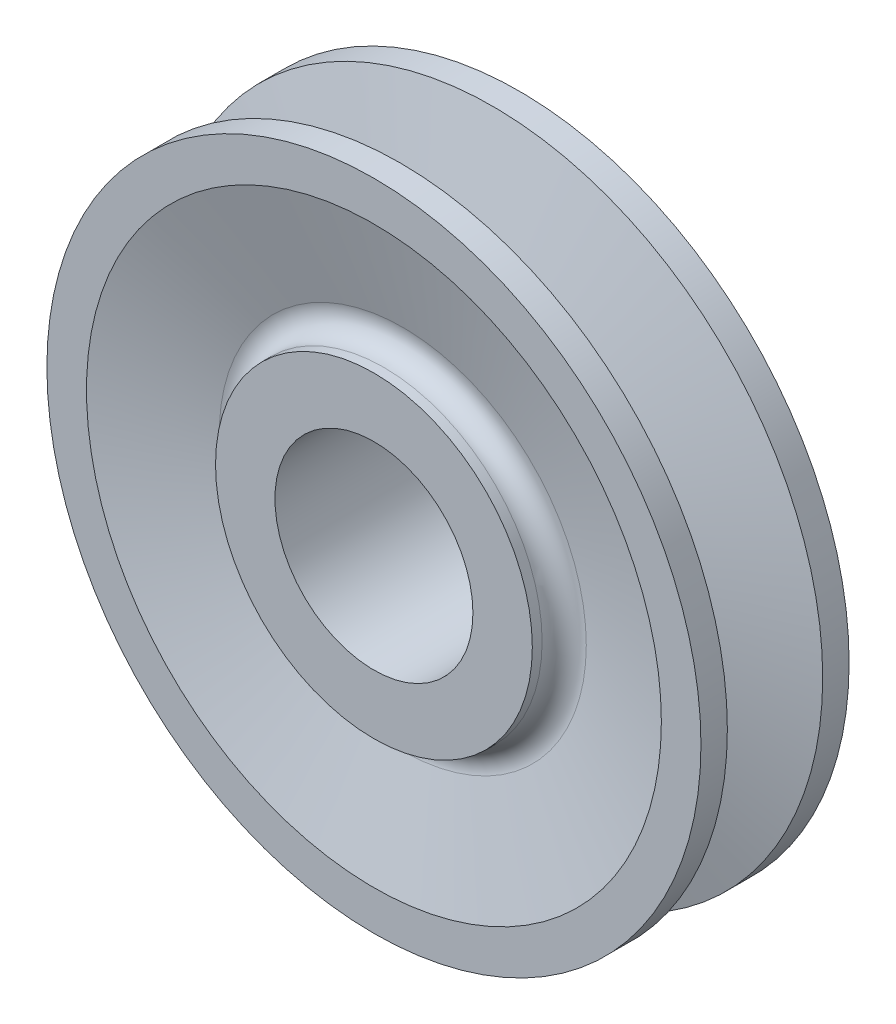
ISO-10303-21;
HEADER;
FILE_DESCRIPTION(('STEP AP214'),'2;1');
FILE_NAME('part.step','',(''),(''),'','','');
FILE_SCHEMA(('AUTOMOTIVE_DESIGN { 1 0 10303 214 1 1 1 1 }'));
ENDSEC;
DATA;
#1=APPLICATION_CONTEXT('core data for automotive mechanical design processes');
#2=APPLICATION_PROTOCOL_DEFINITION('international standard','automotive_design',2000,#1);
#3=PRODUCT_CONTEXT('',#1,'mechanical');
#4=PRODUCT('Part','Part','',(#3));
#5=PRODUCT_RELATED_PRODUCT_CATEGORY('part','',(#4));
#6=PRODUCT_DEFINITION_FORMATION('','',#4);
#7=PRODUCT_DEFINITION_CONTEXT('part definition',#1,'design');
#8=PRODUCT_DEFINITION('design','',#6,#7);
#9=PRODUCT_DEFINITION_SHAPE('','',#8);
#10=(LENGTH_UNIT() NAMED_UNIT(*) SI_UNIT(.MILLI.,.METRE.));
#11=(NAMED_UNIT(*) PLANE_ANGLE_UNIT() SI_UNIT($,.RADIAN.));
#12=(NAMED_UNIT(*) SI_UNIT($,.STERADIAN.) SOLID_ANGLE_UNIT());
#13=UNCERTAINTY_MEASURE_WITH_UNIT(LENGTH_MEASURE(1.E-05),#10,'distance_accuracy_value','');
#14=(GEOMETRIC_REPRESENTATION_CONTEXT(3) GLOBAL_UNCERTAINTY_ASSIGNED_CONTEXT((#13)) GLOBAL_UNIT_ASSIGNED_CONTEXT((#10,
#11,#12)) REPRESENTATION_CONTEXT('',''));
#15=CARTESIAN_POINT('',(0.,0.,0.));
#16=DIRECTION('',(0.,0.,1.));
#17=DIRECTION('',(1.,0.,0.));
#18=AXIS2_PLACEMENT_3D('',#15,#16,#17);
#19=CARTESIAN_POINT('',(0.,0.,0.));
#20=DIRECTION('',(0.,0.,-1.));
#21=DIRECTION('',(-1.,0.,0.));
#22=AXIS2_PLACEMENT_3D('',#19,#20,#21);
#23=PLANE('',#22);
#24=CARTESIAN_POINT('',(0.,-15.,0.));
#25=DIRECTION('',(0.,0.,1.));
#26=DIRECTION('',(1.,0.,0.));
#27=AXIS2_PLACEMENT_3D('',#24,#25,#26);
#28=CIRCLE('',#27,15.);
#29=CARTESIAN_POINT('',(15.,-15.,0.));
#30=VERTEX_POINT('',#29);
#31=EDGE_CURVE('E108',#30,#30,#28,.T.);
#32=ORIENTED_EDGE('',*,*,#31,.F.);
#33=EDGE_LOOP('',(#32));
#34=FACE_BOUND('',#33,.T.);
#35=CARTESIAN_POINT('',(0.,-15.,0.));
#36=DIRECTION('',(0.,0.,1.));
#37=DIRECTION('',(1.,0.,0.));
#38=AXIS2_PLACEMENT_3D('',#35,#36,#37);
#39=CIRCLE('',#38,24.);
#40=CARTESIAN_POINT('',(24.,-15.,0.));
#41=VERTEX_POINT('',#40);
#42=EDGE_CURVE('E10',#41,#41,#39,.T.);
#43=ORIENTED_EDGE('',*,*,#42,.T.);
#44=EDGE_LOOP('',(#43));
#45=FACE_BOUND('',#44,.T.);
#46=ADVANCED_FACE('F41',(#34,#45),#23,.F.);
#47=CARTESIAN_POINT('',(0.,-15.,0.));
#48=DIRECTION('',(0.,0.,1.));
#49=DIRECTION('',(1.,0.,0.));
#50=AXIS2_PLACEMENT_3D('',#47,#48,#49);
#51=CYLINDRICAL_SURFACE('',#50,24.);
#52=ORIENTED_EDGE('',*,*,#42,.F.);
#53=EDGE_LOOP('',(#52));
#54=FACE_BOUND('',#53,.T.);
#55=CARTESIAN_POINT('',(0.,-15.,-1.48527479843894));
#56=DIRECTION('',(0.,0.,1.));
#57=DIRECTION('',(1.,0.,0.));
#58=AXIS2_PLACEMENT_3D('',#55,#56,#57);
#59=CIRCLE('',#58,24.);
#60=CARTESIAN_POINT('',(24.,-15.,-1.48527479843894));
#61=VERTEX_POINT('',#60);
#62=EDGE_CURVE('E48',#61,#61,#59,.T.);
#63=ORIENTED_EDGE('',*,*,#62,.T.);
#64=EDGE_LOOP('',(#63));
#65=FACE_BOUND('',#64,.T.);
#66=ADVANCED_FACE('F116',(#54,#65),#51,.T.);
#67=CARTESIAN_POINT('',(0.,-15.,-1.48527479843894));
#68=DIRECTION('',(0.,0.,1.));
#69=DIRECTION('',(1.,0.,0.));
#70=AXIS2_PLACEMENT_3D('',#67,#68,#69);
#71=TOROIDAL_SURFACE('',#70,27.,3.);
#72=ORIENTED_EDGE('',*,*,#62,.F.);
#73=EDGE_LOOP('',(#72));
#74=FACE_BOUND('',#73,.T.);
#75=CARTESIAN_POINT('',(0.,-15.,-4.37578124991536));
#76=DIRECTION('',(0.,0.,1.));
#77=DIRECTION('',(1.,0.,0.));
#78=AXIS2_PLACEMENT_3D('',#75,#76,#77);
#79=CIRCLE('',#78,27.8031017706201);
#80=CARTESIAN_POINT('',(27.8031017706201,-15.,-4.37578124991536));
#81=VERTEX_POINT('',#80);
#82=EDGE_CURVE('E53',#81,#81,#79,.T.);
#83=ORIENTED_EDGE('',*,*,#82,.T.);
#84=EDGE_LOOP('',(#83));
#85=FACE_BOUND('',#84,.T.);
#86=ADVANCED_FACE('F120',(#74,#85),#71,.F.);
#87=CARTESIAN_POINT('',(0.,-15.,0.));
#88=DIRECTION('',(0.,0.,1.));
#89=DIRECTION('',(1.,0.,0.));
#90=AXIS2_PLACEMENT_3D('',#87,#88,#89);
#91=CONICAL_SURFACE('',#90,43.5523186144127,1.29979060169771);
#92=ORIENTED_EDGE('',*,*,#82,.F.);
#93=EDGE_LOOP('',(#92));
#94=FACE_BOUND('',#93,.T.);
#95=CARTESIAN_POINT('',(0.,-15.,0.));
#96=DIRECTION('',(0.,0.,1.));
#97=DIRECTION('',(1.,0.,0.));
#98=AXIS2_PLACEMENT_3D('',#95,#96,#97);
#99=CIRCLE('',#98,43.5523186144127);
#100=CARTESIAN_POINT('',(43.5523186144127,-15.,0.));
#101=VERTEX_POINT('',#100);
#102=EDGE_CURVE('E58',#101,#101,#99,.T.);
#103=ORIENTED_EDGE('',*,*,#102,.T.);
#104=EDGE_LOOP('',(#103));
#105=FACE_BOUND('',#104,.T.);
#106=ADVANCED_FACE('F125',(#94,#105),#91,.F.);
#107=CARTESIAN_POINT('',(0.,28.5523186144127,0.));
#108=DIRECTION('',(0.,0.,-1.));
#109=DIRECTION('',(-1.,0.,0.));
#110=AXIS2_PLACEMENT_3D('',#107,#108,#109);
#111=PLANE('',#110);
#112=ORIENTED_EDGE('',*,*,#102,.F.);
#113=EDGE_LOOP('',(#112));
#114=FACE_BOUND('',#113,.T.);
#115=CARTESIAN_POINT('',(0.,-15.,0.));
#116=DIRECTION('',(0.,0.,1.));
#117=DIRECTION('',(1.,0.,0.));
#118=AXIS2_PLACEMENT_3D('',#115,#116,#117);
#119=CIRCLE('',#118,49.5523186144127);
#120=CARTESIAN_POINT('',(49.5523186144127,-15.,0.));
#121=VERTEX_POINT('',#120);
#122=EDGE_CURVE('E64',#121,#121,#119,.T.);
#123=ORIENTED_EDGE('',*,*,#122,.T.);
#124=EDGE_LOOP('',(#123));
#125=FACE_BOUND('',#124,.T.);
#126=ADVANCED_FACE('F131',(#114,#125),#111,.F.);
#127=CARTESIAN_POINT('',(0.,-15.,0.));
#128=DIRECTION('',(0.,0.,1.));
#129=DIRECTION('',(1.,0.,0.));
#130=AXIS2_PLACEMENT_3D('',#127,#128,#129);
#131=CYLINDRICAL_SURFACE('',#130,49.5523186144127);
#132=ORIENTED_EDGE('',*,*,#122,.F.);
#133=EDGE_LOOP('',(#132));
#134=FACE_BOUND('',#133,.T.);
#135=CARTESIAN_POINT('',(0.,-15.,-4.));
#136=DIRECTION('',(0.,0.,1.));
#137=DIRECTION('',(1.,0.,0.));
#138=AXIS2_PLACEMENT_3D('',#135,#136,#137);
#139=CIRCLE('',#138,49.5523186144127);
#140=CARTESIAN_POINT('',(49.5523186144127,-15.,-4.));
#141=VERTEX_POINT('',#140);
#142=EDGE_CURVE('E68',#141,#141,#139,.T.);
#143=ORIENTED_EDGE('',*,*,#142,.T.);
#144=EDGE_LOOP('',(#143));
#145=FACE_BOUND('',#144,.T.);
#146=ADVANCED_FACE('F135',(#134,#145),#131,.T.);
#147=CARTESIAN_POINT('',(0.,-15.,-8.87675720305797));
#148=DIRECTION('',(0.,0.,1.));
#149=DIRECTION('',(1.,0.,0.));
#150=AXIS2_PLACEMENT_3D('',#147,#148,#149);
#151=CONICAL_SURFACE('',#150,32.,1.29979060169771);
#152=ORIENTED_EDGE('',*,*,#142,.F.);
#153=EDGE_LOOP('',(#152));
#154=FACE_BOUND('',#153,.T.);
#155=CARTESIAN_POINT('',(0.,-15.,-8.87675720305797));
#156=DIRECTION('',(0.,0.,1.));
#157=DIRECTION('',(1.,0.,0.));
#158=AXIS2_PLACEMENT_3D('',#155,#156,#157);
#159=CIRCLE('',#158,32.);
#160=CARTESIAN_POINT('',(32.,-15.,-8.87675720305797));
#161=VERTEX_POINT('',#160);
#162=EDGE_CURVE('E72',#161,#161,#159,.T.);
#163=ORIENTED_EDGE('',*,*,#162,.T.);
#164=EDGE_LOOP('',(#163));
#165=FACE_BOUND('',#164,.T.);
#166=ADVANCED_FACE('F139',(#154,#165),#151,.T.);
#167=CARTESIAN_POINT('',(0.,-15.,0.));
#168=DIRECTION('',(0.,0.,1.));
#169=DIRECTION('',(1.,0.,0.));
#170=AXIS2_PLACEMENT_3D('',#167,#168,#169);
#171=CYLINDRICAL_SURFACE('',#170,32.);
#172=ORIENTED_EDGE('',*,*,#162,.F.);
#173=EDGE_LOOP('',(#172));
#174=FACE_BOUND('',#173,.T.);
#175=CARTESIAN_POINT('',(0.,-15.,-13.3540942759635));
#176=DIRECTION('',(0.,0.,1.));
#177=DIRECTION('',(1.,0.,0.));
#178=AXIS2_PLACEMENT_3D('',#175,#176,#177);
#179=CIRCLE('',#178,32.);
#180=CARTESIAN_POINT('',(32.,-15.,-13.3540942759635));
#181=VERTEX_POINT('',#180);
#182=EDGE_CURVE('E76',#181,#181,#179,.T.);
#183=ORIENTED_EDGE('',*,*,#182,.T.);
#184=EDGE_LOOP('',(#183));
#185=FACE_BOUND('',#184,.T.);
#186=ADVANCED_FACE('F143',(#174,#185),#171,.T.);
#187=CARTESIAN_POINT('',(0.,-15.,-18.));
#188=DIRECTION('',(0.,0.,-1.));
#189=DIRECTION('',(-1.,0.,0.));
#190=AXIS2_PLACEMENT_3D('',#187,#188,#189);
#191=CONICAL_SURFACE('',#190,50.,1.31820327629379);
#192=ORIENTED_EDGE('',*,*,#182,.F.);
#193=EDGE_LOOP('',(#192));
#194=FACE_BOUND('',#193,.T.);
#195=CARTESIAN_POINT('',(0.,-15.,-18.));
#196=DIRECTION('',(0.,0.,1.));
#197=DIRECTION('',(1.,0.,0.));
#198=AXIS2_PLACEMENT_3D('',#195,#196,#197);
#199=CIRCLE('',#198,50.);
#200=CARTESIAN_POINT('',(50.,-15.,-18.));
#201=VERTEX_POINT('',#200);
#202=EDGE_CURVE('E80',#201,#201,#199,.T.);
#203=ORIENTED_EDGE('',*,*,#202,.T.);
#204=EDGE_LOOP('',(#203));
#205=FACE_BOUND('',#204,.T.);
#206=ADVANCED_FACE('F147',(#194,#205),#191,.T.);
#207=CARTESIAN_POINT('',(0.,-15.,0.));
#208=DIRECTION('',(0.,0.,1.));
#209=DIRECTION('',(1.,0.,0.));
#210=AXIS2_PLACEMENT_3D('',#207,#208,#209);
#211=CYLINDRICAL_SURFACE('',#210,50.);
#212=ORIENTED_EDGE('',*,*,#202,.F.);
#213=EDGE_LOOP('',(#212));
#214=FACE_BOUND('',#213,.T.);
#215=CARTESIAN_POINT('',(0.,-15.,-22.));
#216=DIRECTION('',(0.,0.,1.));
#217=DIRECTION('',(1.,0.,0.));
#218=AXIS2_PLACEMENT_3D('',#215,#216,#217);
#219=CIRCLE('',#218,50.);
#220=CARTESIAN_POINT('',(50.,-15.,-22.));
#221=VERTEX_POINT('',#220);
#222=EDGE_CURVE('E84',#221,#221,#219,.T.);
#223=ORIENTED_EDGE('',*,*,#222,.T.);
#224=EDGE_LOOP('',(#223));
#225=FACE_BOUND('',#224,.T.);
#226=ADVANCED_FACE('F151',(#214,#225),#211,.T.);
#227=CARTESIAN_POINT('',(0.,35.,-22.));
#228=DIRECTION('',(0.,0.,1.));
#229=DIRECTION('',(1.,0.,0.));
#230=AXIS2_PLACEMENT_3D('',#227,#228,#229);
#231=PLANE('',#230);
#232=ORIENTED_EDGE('',*,*,#222,.F.);
#233=EDGE_LOOP('',(#232));
#234=FACE_BOUND('',#233,.T.);
#235=CARTESIAN_POINT('',(0.,-15.,-22.));
#236=DIRECTION('',(0.,0.,1.));
#237=DIRECTION('',(1.,0.,0.));
#238=AXIS2_PLACEMENT_3D('',#235,#236,#237);
#239=CIRCLE('',#238,44.);
#240=CARTESIAN_POINT('',(44.,-15.,-22.));
#241=VERTEX_POINT('',#240);
#242=EDGE_CURVE('E88',#241,#241,#239,.T.);
#243=ORIENTED_EDGE('',*,*,#242,.T.);
#244=EDGE_LOOP('',(#243));
#245=FACE_BOUND('',#244,.T.);
#246=ADVANCED_FACE('F155',(#234,#245),#231,.F.);
#247=CARTESIAN_POINT('',(0.,-15.,-18.77354581922));
#248=DIRECTION('',(0.,0.,-1.));
#249=DIRECTION('',(-1.,0.,0.));
#250=AXIS2_PLACEMENT_3D('',#247,#248,#249);
#251=CONICAL_SURFACE('',#250,31.4994933811138,1.31820327629379);
#252=ORIENTED_EDGE('',*,*,#242,.F.);
#253=EDGE_LOOP('',(#252));
#254=FACE_BOUND('',#253,.T.);
#255=CARTESIAN_POINT('',(0.,-15.,-18.77354581922));
#256=DIRECTION('',(0.,0.,1.));
#257=DIRECTION('',(1.,0.,0.));
#258=AXIS2_PLACEMENT_3D('',#255,#256,#257);
#259=CIRCLE('',#258,31.4994933811138);
#260=CARTESIAN_POINT('',(31.4994933811138,-15.,-18.77354581922));
#261=VERTEX_POINT('',#260);
#262=EDGE_CURVE('E92',#261,#261,#259,.T.);
#263=ORIENTED_EDGE('',*,*,#262,.T.);
#264=EDGE_LOOP('',(#263));
#265=FACE_BOUND('',#264,.T.);
#266=ADVANCED_FACE('F159',(#254,#265),#251,.F.);
#267=CARTESIAN_POINT('',(0.,-15.,-24.583151623403));
#268=DIRECTION('',(0.,0.,1.));
#269=DIRECTION('',(1.,0.,0.));
#270=AXIS2_PLACEMENT_3D('',#267,#268,#269);
#271=TOROIDAL_SURFACE('',#270,30.,6.);
#272=ORIENTED_EDGE('',*,*,#262,.F.);
#273=EDGE_LOOP('',(#272));
#274=FACE_BOUND('',#273,.T.);
#275=CARTESIAN_POINT('',(0.,-15.,-24.583151623403));
#276=DIRECTION('',(0.,0.,1.));
#277=DIRECTION('',(1.,0.,0.));
#278=AXIS2_PLACEMENT_3D('',#275,#276,#277);
#279=CIRCLE('',#278,24.);
#280=CARTESIAN_POINT('',(24.,-15.,-24.583151623403));
#281=VERTEX_POINT('',#280);
#282=EDGE_CURVE('E96',#281,#281,#279,.T.);
#283=ORIENTED_EDGE('',*,*,#282,.T.);
#284=EDGE_LOOP('',(#283));
#285=FACE_BOUND('',#284,.T.);
#286=ADVANCED_FACE('F163',(#274,#285),#271,.F.);
#287=CARTESIAN_POINT('',(0.,-15.,0.));
#288=DIRECTION('',(0.,0.,1.));
#289=DIRECTION('',(1.,0.,0.));
#290=AXIS2_PLACEMENT_3D('',#287,#288,#289);
#291=CYLINDRICAL_SURFACE('',#290,24.);
#292=ORIENTED_EDGE('',*,*,#282,.F.);
#293=EDGE_LOOP('',(#292));
#294=FACE_BOUND('',#293,.T.);
#295=CARTESIAN_POINT('',(0.,-15.,-31.));
#296=DIRECTION('',(0.,0.,1.));
#297=DIRECTION('',(1.,0.,0.));
#298=AXIS2_PLACEMENT_3D('',#295,#296,#297);
#299=CIRCLE('',#298,24.);
#300=CARTESIAN_POINT('',(24.,-15.,-31.));
#301=VERTEX_POINT('',#300);
#302=EDGE_CURVE('E100',#301,#301,#299,.T.);
#303=ORIENTED_EDGE('',*,*,#302,.T.);
#304=EDGE_LOOP('',(#303));
#305=FACE_BOUND('',#304,.T.);
#306=ADVANCED_FACE('F167',(#294,#305),#291,.T.);
#307=CARTESIAN_POINT('',(0.,0.,-31.));
#308=DIRECTION('',(0.,0.,1.));
#309=DIRECTION('',(1.,0.,0.));
#310=AXIS2_PLACEMENT_3D('',#307,#308,#309);
#311=PLANE('',#310);
#312=ORIENTED_EDGE('',*,*,#302,.F.);
#313=EDGE_LOOP('',(#312));
#314=FACE_BOUND('',#313,.T.);
#315=CARTESIAN_POINT('',(0.,-15.,-31.));
#316=DIRECTION('',(0.,0.,1.));
#317=DIRECTION('',(1.,0.,0.));
#318=AXIS2_PLACEMENT_3D('',#315,#316,#317);
#319=CIRCLE('',#318,15.);
#320=CARTESIAN_POINT('',(15.,-15.,-31.));
#321=VERTEX_POINT('',#320);
#322=EDGE_CURVE('E104',#321,#321,#319,.T.);
#323=ORIENTED_EDGE('',*,*,#322,.T.);
#324=EDGE_LOOP('',(#323));
#325=FACE_BOUND('',#324,.T.);
#326=ADVANCED_FACE('F171',(#314,#325),#311,.F.);
#327=CARTESIAN_POINT('',(0.,-15.,0.));
#328=DIRECTION('',(0.,0.,1.));
#329=DIRECTION('',(1.,0.,0.));
#330=AXIS2_PLACEMENT_3D('',#327,#328,#329);
#331=CYLINDRICAL_SURFACE('',#330,15.);
#332=ORIENTED_EDGE('',*,*,#322,.F.);
#333=EDGE_LOOP('',(#332));
#334=FACE_BOUND('',#333,.T.);
#335=ORIENTED_EDGE('',*,*,#31,.T.);
#336=EDGE_LOOP('',(#335));
#337=FACE_BOUND('',#336,.T.);
#338=ADVANCED_FACE('F113',(#334,#337),#331,.F.);
#339=CLOSED_SHELL('',(#46,#66,#86,#106,#126,#146,#166,#186,#206,#226,#246,#266,#286,#306,#326,#338));
#340=MANIFOLD_SOLID_BREP('B2',#339);
#341=ADVANCED_BREP_SHAPE_REPRESENTATION('',(#18,#340),#14);
#342=SHAPE_DEFINITION_REPRESENTATION(#9,#341);
ENDSEC;
END-ISO-10303-21;
